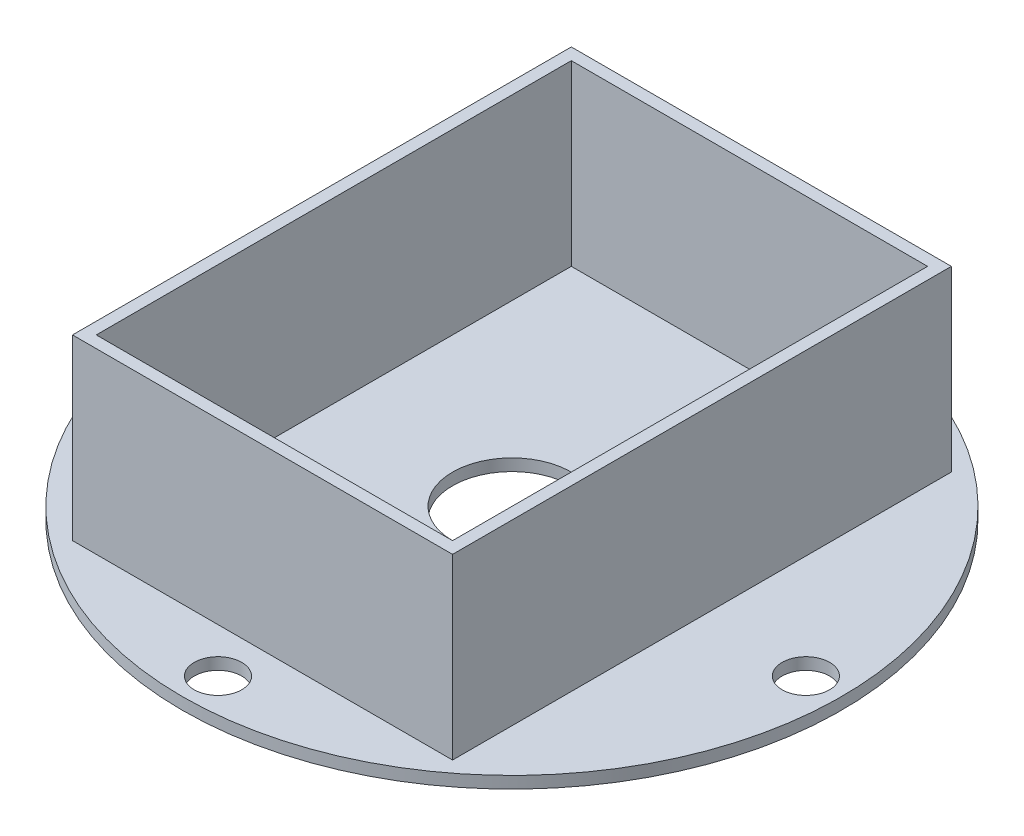
ISO-10303-21;
HEADER;
FILE_DESCRIPTION(('STEP AP214'),'2;1');
FILE_NAME('part.step','',(''),(''),'','','');
FILE_SCHEMA(('AUTOMOTIVE_DESIGN { 1 0 10303 214 1 1 1 1 }'));
ENDSEC;
DATA;
#1=APPLICATION_CONTEXT('core data for automotive mechanical design processes');
#2=APPLICATION_PROTOCOL_DEFINITION('international standard','automotive_design',2000,#1);
#3=PRODUCT_CONTEXT('',#1,'mechanical');
#4=PRODUCT('Part','Part','',(#3));
#5=PRODUCT_RELATED_PRODUCT_CATEGORY('part','',(#4));
#6=PRODUCT_DEFINITION_FORMATION('','',#4);
#7=PRODUCT_DEFINITION_CONTEXT('part definition',#1,'design');
#8=PRODUCT_DEFINITION('design','',#6,#7);
#9=PRODUCT_DEFINITION_SHAPE('','',#8);
#10=(LENGTH_UNIT() NAMED_UNIT(*) SI_UNIT(.MILLI.,.METRE.));
#11=(NAMED_UNIT(*) PLANE_ANGLE_UNIT() SI_UNIT($,.RADIAN.));
#12=(NAMED_UNIT(*) SI_UNIT($,.STERADIAN.) SOLID_ANGLE_UNIT());
#13=UNCERTAINTY_MEASURE_WITH_UNIT(LENGTH_MEASURE(1.E-05),#10,'distance_accuracy_value','');
#14=(GEOMETRIC_REPRESENTATION_CONTEXT(3) GLOBAL_UNCERTAINTY_ASSIGNED_CONTEXT((#13)) GLOBAL_UNIT_ASSIGNED_CONTEXT((#10,
#11,#12)) REPRESENTATION_CONTEXT('',''));
#15=CARTESIAN_POINT('',(0.,0.,0.));
#16=DIRECTION('',(0.,0.,1.));
#17=DIRECTION('',(1.,0.,0.));
#18=AXIS2_PLACEMENT_3D('',#15,#16,#17);
#19=CARTESIAN_POINT('',(0.,2.,0.));
#20=DIRECTION('',(0.,1.,0.));
#21=DIRECTION('',(0.,0.,1.));
#22=AXIS2_PLACEMENT_3D('',#19,#20,#21);
#23=PLANE('',#22);
#24=CARTESIAN_POINT('',(0.,2.,49.5));
#25=DIRECTION('',(0.,1.,0.));
#26=DIRECTION('',(0.,0.,1.));
#27=AXIS2_PLACEMENT_3D('',#24,#25,#26);
#28=CIRCLE('',#27,4.);
#29=CARTESIAN_POINT('',(0.,2.,53.5));
#30=VERTEX_POINT('',#29);
#31=EDGE_CURVE('E206',#30,#30,#28,.T.);
#32=ORIENTED_EDGE('',*,*,#31,.F.);
#33=EDGE_LOOP('',(#32));
#34=FACE_BOUND('',#33,.T.);
#35=CARTESIAN_POINT('',(49.5,2.,0.));
#36=DIRECTION('',(0.,1.,0.));
#37=DIRECTION('',(0.,0.,1.));
#38=AXIS2_PLACEMENT_3D('',#35,#36,#37);
#39=CIRCLE('',#38,4.);
#40=CARTESIAN_POINT('',(49.5,2.,4.));
#41=VERTEX_POINT('',#40);
#42=EDGE_CURVE('E222',#41,#41,#39,.T.);
#43=ORIENTED_EDGE('',*,*,#42,.F.);
#44=EDGE_LOOP('',(#43));
#45=FACE_BOUND('',#44,.T.);
#46=CARTESIAN_POINT('',(0.,2.,0.));
#47=DIRECTION('',(0.,1.,0.));
#48=DIRECTION('',(0.,0.,1.));
#49=AXIS2_PLACEMENT_3D('',#46,#47,#48);
#50=CIRCLE('',#49,55.5);
#51=CARTESIAN_POINT('',(0.,2.,55.5));
#52=VERTEX_POINT('',#51);
#53=EDGE_CURVE('E11',#52,#52,#50,.T.);
#54=ORIENTED_EDGE('',*,*,#53,.T.);
#55=EDGE_LOOP('',(#54));
#56=FACE_BOUND('',#55,.T.);
#57=CARTESIAN_POINT('',(0.,2.,-49.5));
#58=DIRECTION('',(0.,1.,0.));
#59=DIRECTION('',(0.,0.,1.));
#60=AXIS2_PLACEMENT_3D('',#57,#58,#59);
#61=CIRCLE('',#60,4.);
#62=CARTESIAN_POINT('',(0.,2.,-45.5));
#63=VERTEX_POINT('',#62);
#64=EDGE_CURVE('E230',#63,#63,#61,.T.);
#65=ORIENTED_EDGE('',*,*,#64,.F.);
#66=EDGE_LOOP('',(#65));
#67=FACE_BOUND('',#66,.T.);
#68=CARTESIAN_POINT('',(-49.5,2.,0.));
#69=DIRECTION('',(0.,1.,0.));
#70=DIRECTION('',(0.,0.,1.));
#71=AXIS2_PLACEMENT_3D('',#68,#69,#70);
#72=CIRCLE('',#71,4.);
#73=CARTESIAN_POINT('',(-49.5,2.,4.));
#74=VERTEX_POINT('',#73);
#75=EDGE_CURVE('E214',#74,#74,#72,.T.);
#76=ORIENTED_EDGE('',*,*,#75,.F.);
#77=EDGE_LOOP('',(#76));
#78=FACE_BOUND('',#77,.T.);
#79=DIRECTION('',(-1.,0.,0.));
#80=VECTOR('',#79,1.);
#81=CARTESIAN_POINT('',(-32.,2.,-42.));
#82=LINE('',#81,#80);
#83=CARTESIAN_POINT('',(32.,2.,-42.));
#84=VERTEX_POINT('',#83);
#85=CARTESIAN_POINT('',(-32.,2.,-42.));
#86=VERTEX_POINT('',#85);
#87=EDGE_CURVE('E185',#84,#86,#82,.T.);
#88=ORIENTED_EDGE('',*,*,#87,.F.);
#89=DIRECTION('',(0.,0.,-1.));
#90=VECTOR('',#89,1.);
#91=CARTESIAN_POINT('',(32.,2.,-42.));
#92=LINE('',#91,#90);
#93=CARTESIAN_POINT('',(32.,2.,42.));
#94=VERTEX_POINT('',#93);
#95=EDGE_CURVE('E134',#94,#84,#92,.T.);
#96=ORIENTED_EDGE('',*,*,#95,.F.);
#97=DIRECTION('',(1.,0.,0.));
#98=VECTOR('',#97,1.);
#99=CARTESIAN_POINT('',(-32.,2.,42.));
#100=LINE('',#99,#98);
#101=CARTESIAN_POINT('',(-32.,2.,42.));
#102=VERTEX_POINT('',#101);
#103=EDGE_CURVE('E172',#102,#94,#100,.T.);
#104=ORIENTED_EDGE('',*,*,#103,.F.);
#105=DIRECTION('',(0.,0.,1.));
#106=VECTOR('',#105,1.);
#107=CARTESIAN_POINT('',(-32.,2.,-42.));
#108=LINE('',#107,#106);
#109=EDGE_CURVE('E188',#86,#102,#108,.T.);
#110=ORIENTED_EDGE('',*,*,#109,.F.);
#111=EDGE_LOOP('',(#88,#96,#104,#110));
#112=FACE_BOUND('',#111,.T.);
#113=ADVANCED_FACE('F45',(#34,#45,#56,#67,#78,#112),#23,.T.);
#114=CARTESIAN_POINT('',(0.,0.,0.));
#115=DIRECTION('',(0.,1.,0.));
#116=DIRECTION('',(0.,0.,1.));
#117=AXIS2_PLACEMENT_3D('',#114,#115,#116);
#118=PLANE('',#117);
#119=CARTESIAN_POINT('',(0.,0.,0.));
#120=DIRECTION('',(0.,1.,0.));
#121=DIRECTION('',(0.,0.,1.));
#122=AXIS2_PLACEMENT_3D('',#119,#120,#121);
#123=CIRCLE('',#122,10.);
#124=CARTESIAN_POINT('',(0.,0.,10.));
#125=VERTEX_POINT('',#124);
#126=EDGE_CURVE('E49',#125,#125,#123,.T.);
#127=ORIENTED_EDGE('',*,*,#126,.T.);
#128=EDGE_LOOP('',(#127));
#129=FACE_BOUND('',#128,.T.);
#130=CARTESIAN_POINT('',(0.,0.,0.));
#131=DIRECTION('',(0.,1.,0.));
#132=DIRECTION('',(0.,0.,1.));
#133=AXIS2_PLACEMENT_3D('',#130,#131,#132);
#134=CIRCLE('',#133,55.5);
#135=CARTESIAN_POINT('',(0.,0.,55.5));
#136=VERTEX_POINT('',#135);
#137=EDGE_CURVE('E55',#136,#136,#134,.T.);
#138=ORIENTED_EDGE('',*,*,#137,.F.);
#139=EDGE_LOOP('',(#138));
#140=FACE_BOUND('',#139,.T.);
#141=CARTESIAN_POINT('',(0.,0.,-49.5));
#142=DIRECTION('',(0.,1.,0.));
#143=DIRECTION('',(0.,0.,1.));
#144=AXIS2_PLACEMENT_3D('',#141,#142,#143);
#145=CIRCLE('',#144,4.);
#146=CARTESIAN_POINT('',(0.,0.,-45.5));
#147=VERTEX_POINT('',#146);
#148=EDGE_CURVE('E226',#147,#147,#145,.T.);
#149=ORIENTED_EDGE('',*,*,#148,.T.);
#150=EDGE_LOOP('',(#149));
#151=FACE_BOUND('',#150,.T.);
#152=CARTESIAN_POINT('',(49.5,0.,0.));
#153=DIRECTION('',(0.,1.,0.));
#154=DIRECTION('',(0.,0.,1.));
#155=AXIS2_PLACEMENT_3D('',#152,#153,#154);
#156=CIRCLE('',#155,4.);
#157=CARTESIAN_POINT('',(49.5,0.,4.));
#158=VERTEX_POINT('',#157);
#159=EDGE_CURVE('E218',#158,#158,#156,.T.);
#160=ORIENTED_EDGE('',*,*,#159,.T.);
#161=EDGE_LOOP('',(#160));
#162=FACE_BOUND('',#161,.T.);
#163=CARTESIAN_POINT('',(-49.5,0.,0.));
#164=DIRECTION('',(0.,1.,0.));
#165=DIRECTION('',(0.,0.,1.));
#166=AXIS2_PLACEMENT_3D('',#163,#164,#165);
#167=CIRCLE('',#166,4.);
#168=CARTESIAN_POINT('',(-49.5,0.,4.));
#169=VERTEX_POINT('',#168);
#170=EDGE_CURVE('E210',#169,#169,#167,.T.);
#171=ORIENTED_EDGE('',*,*,#170,.T.);
#172=EDGE_LOOP('',(#171));
#173=FACE_BOUND('',#172,.T.);
#174=CARTESIAN_POINT('',(0.,0.,49.5));
#175=DIRECTION('',(0.,1.,0.));
#176=DIRECTION('',(0.,0.,1.));
#177=AXIS2_PLACEMENT_3D('',#174,#175,#176);
#178=CIRCLE('',#177,4.);
#179=CARTESIAN_POINT('',(0.,0.,53.5));
#180=VERTEX_POINT('',#179);
#181=EDGE_CURVE('E205',#180,#180,#178,.T.);
#182=ORIENTED_EDGE('',*,*,#181,.T.);
#183=EDGE_LOOP('',(#182));
#184=FACE_BOUND('',#183,.T.);
#185=ADVANCED_FACE('F241',(#129,#140,#151,#162,#173,#184),#118,.F.);
#186=CARTESIAN_POINT('',(0.,2.,0.));
#187=DIRECTION('',(0.,-1.,0.));
#188=DIRECTION('',(0.,0.,-1.));
#189=AXIS2_PLACEMENT_3D('',#186,#187,#188);
#190=CYLINDRICAL_SURFACE('',#189,55.5);
#191=ORIENTED_EDGE('',*,*,#53,.F.);
#192=EDGE_LOOP('',(#191));
#193=FACE_BOUND('',#192,.T.);
#194=ORIENTED_EDGE('',*,*,#137,.T.);
#195=EDGE_LOOP('',(#194));
#196=FACE_BOUND('',#195,.T.);
#197=ADVANCED_FACE('F47',(#193,#196),#190,.T.);
#198=CARTESIAN_POINT('',(0.,2.,-49.5));
#199=DIRECTION('',(0.,-1.,0.));
#200=DIRECTION('',(0.,0.,-1.));
#201=AXIS2_PLACEMENT_3D('',#198,#199,#200);
#202=CYLINDRICAL_SURFACE('',#201,4.);
#203=ORIENTED_EDGE('',*,*,#64,.T.);
#204=EDGE_LOOP('',(#203));
#205=FACE_BOUND('',#204,.T.);
#206=ORIENTED_EDGE('',*,*,#148,.F.);
#207=EDGE_LOOP('',(#206));
#208=FACE_BOUND('',#207,.T.);
#209=ADVANCED_FACE('F408',(#205,#208),#202,.F.);
#210=CARTESIAN_POINT('',(49.5,2.,0.));
#211=DIRECTION('',(0.,-1.,0.));
#212=DIRECTION('',(0.,0.,-1.));
#213=AXIS2_PLACEMENT_3D('',#210,#211,#212);
#214=CYLINDRICAL_SURFACE('',#213,4.);
#215=ORIENTED_EDGE('',*,*,#42,.T.);
#216=EDGE_LOOP('',(#215));
#217=FACE_BOUND('',#216,.T.);
#218=ORIENTED_EDGE('',*,*,#159,.F.);
#219=EDGE_LOOP('',(#218));
#220=FACE_BOUND('',#219,.T.);
#221=ADVANCED_FACE('F266',(#217,#220),#214,.F.);
#222=CARTESIAN_POINT('',(-49.5,2.,0.));
#223=DIRECTION('',(0.,-1.,0.));
#224=DIRECTION('',(0.,0.,-1.));
#225=AXIS2_PLACEMENT_3D('',#222,#223,#224);
#226=CYLINDRICAL_SURFACE('',#225,4.);
#227=ORIENTED_EDGE('',*,*,#75,.T.);
#228=EDGE_LOOP('',(#227));
#229=FACE_BOUND('',#228,.T.);
#230=ORIENTED_EDGE('',*,*,#170,.F.);
#231=EDGE_LOOP('',(#230));
#232=FACE_BOUND('',#231,.T.);
#233=ADVANCED_FACE('F255',(#229,#232),#226,.F.);
#234=CARTESIAN_POINT('',(0.,2.,49.5));
#235=DIRECTION('',(0.,-1.,0.));
#236=DIRECTION('',(0.,0.,-1.));
#237=AXIS2_PLACEMENT_3D('',#234,#235,#236);
#238=CYLINDRICAL_SURFACE('',#237,4.);
#239=ORIENTED_EDGE('',*,*,#31,.T.);
#240=EDGE_LOOP('',(#239));
#241=FACE_BOUND('',#240,.T.);
#242=ORIENTED_EDGE('',*,*,#181,.F.);
#243=EDGE_LOOP('',(#242));
#244=FACE_BOUND('',#243,.T.);
#245=ADVANCED_FACE('F253',(#241,#244),#238,.F.);
#246=CARTESIAN_POINT('',(0.,32.,0.));
#247=DIRECTION('',(0.,1.,0.));
#248=DIRECTION('',(0.,0.,1.));
#249=AXIS2_PLACEMENT_3D('',#246,#247,#248);
#250=PLANE('',#249);
#251=DIRECTION('',(0.,0.,-1.));
#252=VECTOR('',#251,1.);
#253=CARTESIAN_POINT('',(32.,32.,-42.));
#254=LINE('',#253,#252);
#255=CARTESIAN_POINT('',(32.,32.,42.));
#256=VERTEX_POINT('',#255);
#257=CARTESIAN_POINT('',(32.,32.,-42.));
#258=VERTEX_POINT('',#257);
#259=EDGE_CURVE('E167',#256,#258,#254,.T.);
#260=ORIENTED_EDGE('',*,*,#259,.T.);
#261=DIRECTION('',(-1.,0.,0.));
#262=VECTOR('',#261,1.);
#263=CARTESIAN_POINT('',(-32.,32.,-42.));
#264=LINE('',#263,#262);
#265=CARTESIAN_POINT('',(-32.,32.,-42.));
#266=VERTEX_POINT('',#265);
#267=EDGE_CURVE('E171',#258,#266,#264,.T.);
#268=ORIENTED_EDGE('',*,*,#267,.T.);
#269=DIRECTION('',(0.,0.,1.));
#270=VECTOR('',#269,1.);
#271=CARTESIAN_POINT('',(-32.,32.,-42.));
#272=LINE('',#271,#270);
#273=CARTESIAN_POINT('',(-32.,32.,42.));
#274=VERTEX_POINT('',#273);
#275=EDGE_CURVE('E175',#266,#274,#272,.T.);
#276=ORIENTED_EDGE('',*,*,#275,.T.);
#277=DIRECTION('',(1.,0.,0.));
#278=VECTOR('',#277,1.);
#279=CARTESIAN_POINT('',(-32.,32.,42.));
#280=LINE('',#279,#278);
#281=EDGE_CURVE('E178',#274,#256,#280,.T.);
#282=ORIENTED_EDGE('',*,*,#281,.T.);
#283=EDGE_LOOP('',(#260,#268,#276,#282));
#284=FACE_BOUND('',#283,.T.);
#285=DIRECTION('',(-1.,0.,0.));
#286=VECTOR('',#285,1.);
#287=CARTESIAN_POINT('',(-30.,32.,-40.));
#288=LINE('',#287,#286);
#289=CARTESIAN_POINT('',(30.,32.,-40.));
#290=VERTEX_POINT('',#289);
#291=CARTESIAN_POINT('',(-30.,32.,-40.));
#292=VERTEX_POINT('',#291);
#293=EDGE_CURVE('E125',#290,#292,#288,.T.);
#294=ORIENTED_EDGE('',*,*,#293,.F.);
#295=DIRECTION('',(0.,0.,-1.));
#296=VECTOR('',#295,1.);
#297=CARTESIAN_POINT('',(30.,32.,-40.));
#298=LINE('',#297,#296);
#299=CARTESIAN_POINT('',(30.,32.,40.));
#300=VERTEX_POINT('',#299);
#301=EDGE_CURVE('E115',#300,#290,#298,.T.);
#302=ORIENTED_EDGE('',*,*,#301,.F.);
#303=DIRECTION('',(1.,0.,0.));
#304=VECTOR('',#303,1.);
#305=CARTESIAN_POINT('',(-30.,32.,40.));
#306=LINE('',#305,#304);
#307=CARTESIAN_POINT('',(-30.,32.,40.));
#308=VERTEX_POINT('',#307);
#309=EDGE_CURVE('E144',#308,#300,#306,.T.);
#310=ORIENTED_EDGE('',*,*,#309,.F.);
#311=DIRECTION('',(0.,0.,1.));
#312=VECTOR('',#311,1.);
#313=CARTESIAN_POINT('',(-30.,32.,-40.));
#314=LINE('',#313,#312);
#315=EDGE_CURVE('E140',#292,#308,#314,.T.);
#316=ORIENTED_EDGE('',*,*,#315,.F.);
#317=EDGE_LOOP('',(#294,#302,#310,#316));
#318=FACE_BOUND('',#317,.T.);
#319=ADVANCED_FACE('F138',(#284,#318),#250,.T.);
#320=CARTESIAN_POINT('',(32.,32.,-42.));
#321=DIRECTION('',(-1.,0.,0.));
#322=DIRECTION('',(0.,0.,1.));
#323=AXIS2_PLACEMENT_3D('',#320,#321,#322);
#324=PLANE('',#323);
#325=ORIENTED_EDGE('',*,*,#95,.T.);
#326=DIRECTION('',(0.,-1.,0.));
#327=VECTOR('',#326,1.);
#328=CARTESIAN_POINT('',(32.,32.,-42.));
#329=LINE('',#328,#327);
#330=EDGE_CURVE('E202',#258,#84,#329,.T.);
#331=ORIENTED_EDGE('',*,*,#330,.F.);
#332=ORIENTED_EDGE('',*,*,#259,.F.);
#333=DIRECTION('',(0.,-1.,0.));
#334=VECTOR('',#333,1.);
#335=CARTESIAN_POINT('',(32.,32.,42.));
#336=LINE('',#335,#334);
#337=EDGE_CURVE('E181',#256,#94,#336,.T.);
#338=ORIENTED_EDGE('',*,*,#337,.T.);
#339=EDGE_LOOP('',(#325,#331,#332,#338));
#340=FACE_BOUND('',#339,.T.);
#341=ADVANCED_FACE('F263',(#340),#324,.F.);
#342=CARTESIAN_POINT('',(-32.,32.,-42.));
#343=DIRECTION('',(0.,0.,1.));
#344=DIRECTION('',(1.,0.,0.));
#345=AXIS2_PLACEMENT_3D('',#342,#343,#344);
#346=PLANE('',#345);
#347=ORIENTED_EDGE('',*,*,#87,.T.);
#348=DIRECTION('',(0.,-1.,0.));
#349=VECTOR('',#348,1.);
#350=CARTESIAN_POINT('',(-32.,32.,-42.));
#351=LINE('',#350,#349);
#352=EDGE_CURVE('E198',#266,#86,#351,.T.);
#353=ORIENTED_EDGE('',*,*,#352,.F.);
#354=ORIENTED_EDGE('',*,*,#267,.F.);
#355=ORIENTED_EDGE('',*,*,#330,.T.);
#356=EDGE_LOOP('',(#347,#353,#354,#355));
#357=FACE_BOUND('',#356,.T.);
#358=ADVANCED_FACE('F316',(#357),#346,.F.);
#359=CARTESIAN_POINT('',(-32.,32.,-42.));
#360=DIRECTION('',(1.,0.,0.));
#361=DIRECTION('',(0.,0.,-1.));
#362=AXIS2_PLACEMENT_3D('',#359,#360,#361);
#363=PLANE('',#362);
#364=ORIENTED_EDGE('',*,*,#109,.T.);
#365=DIRECTION('',(0.,-1.,0.));
#366=VECTOR('',#365,1.);
#367=CARTESIAN_POINT('',(-32.,32.,42.));
#368=LINE('',#367,#366);
#369=EDGE_CURVE('E63',#274,#102,#368,.T.);
#370=ORIENTED_EDGE('',*,*,#369,.F.);
#371=ORIENTED_EDGE('',*,*,#275,.F.);
#372=ORIENTED_EDGE('',*,*,#352,.T.);
#373=EDGE_LOOP('',(#364,#370,#371,#372));
#374=FACE_BOUND('',#373,.T.);
#375=ADVANCED_FACE('F313',(#374),#363,.F.);
#376=CARTESIAN_POINT('',(-32.,32.,42.));
#377=DIRECTION('',(0.,0.,-1.));
#378=DIRECTION('',(-1.,0.,0.));
#379=AXIS2_PLACEMENT_3D('',#376,#377,#378);
#380=PLANE('',#379);
#381=ORIENTED_EDGE('',*,*,#103,.T.);
#382=ORIENTED_EDGE('',*,*,#337,.F.);
#383=ORIENTED_EDGE('',*,*,#281,.F.);
#384=ORIENTED_EDGE('',*,*,#369,.T.);
#385=EDGE_LOOP('',(#381,#382,#383,#384));
#386=FACE_BOUND('',#385,.T.);
#387=ADVANCED_FACE('F309',(#386),#380,.F.);
#388=CARTESIAN_POINT('',(30.,32.,-40.));
#389=DIRECTION('',(-1.,0.,0.));
#390=DIRECTION('',(0.,0.,1.));
#391=AXIS2_PLACEMENT_3D('',#388,#389,#390);
#392=PLANE('',#391);
#393=DIRECTION('',(0.,0.,-1.));
#394=VECTOR('',#393,1.);
#395=CARTESIAN_POINT('',(30.,2.,-40.));
#396=LINE('',#395,#394);
#397=CARTESIAN_POINT('',(30.,2.,40.));
#398=VERTEX_POINT('',#397);
#399=CARTESIAN_POINT('',(30.,2.,-40.));
#400=VERTEX_POINT('',#399);
#401=EDGE_CURVE('E71',#398,#400,#396,.T.);
#402=ORIENTED_EDGE('',*,*,#401,.F.);
#403=DIRECTION('',(0.,-1.,0.));
#404=VECTOR('',#403,1.);
#405=CARTESIAN_POINT('',(30.,32.,40.));
#406=LINE('',#405,#404);
#407=EDGE_CURVE('E120',#300,#398,#406,.T.);
#408=ORIENTED_EDGE('',*,*,#407,.F.);
#409=ORIENTED_EDGE('',*,*,#301,.T.);
#410=DIRECTION('',(0.,-1.,0.));
#411=VECTOR('',#410,1.);
#412=CARTESIAN_POINT('',(30.,32.,-40.));
#413=LINE('',#412,#411);
#414=EDGE_CURVE('E118',#290,#400,#413,.T.);
#415=ORIENTED_EDGE('',*,*,#414,.T.);
#416=EDGE_LOOP('',(#402,#408,#409,#415));
#417=FACE_BOUND('',#416,.T.);
#418=ADVANCED_FACE('F117',(#417),#392,.T.);
#419=CARTESIAN_POINT('',(-30.,32.,-40.));
#420=DIRECTION('',(0.,0.,1.));
#421=DIRECTION('',(1.,0.,0.));
#422=AXIS2_PLACEMENT_3D('',#419,#420,#421);
#423=PLANE('',#422);
#424=DIRECTION('',(-1.,0.,0.));
#425=VECTOR('',#424,1.);
#426=CARTESIAN_POINT('',(-30.,2.,-40.));
#427=LINE('',#426,#425);
#428=CARTESIAN_POINT('',(-30.,2.,-40.));
#429=VERTEX_POINT('',#428);
#430=EDGE_CURVE('E132',#400,#429,#427,.T.);
#431=ORIENTED_EDGE('',*,*,#430,.F.);
#432=ORIENTED_EDGE('',*,*,#414,.F.);
#433=ORIENTED_EDGE('',*,*,#293,.T.);
#434=DIRECTION('',(0.,-1.,0.));
#435=VECTOR('',#434,1.);
#436=CARTESIAN_POINT('',(-30.,32.,-40.));
#437=LINE('',#436,#435);
#438=EDGE_CURVE('E135',#292,#429,#437,.T.);
#439=ORIENTED_EDGE('',*,*,#438,.T.);
#440=EDGE_LOOP('',(#431,#432,#433,#439));
#441=FACE_BOUND('',#440,.T.);
#442=ADVANCED_FACE('F129',(#441),#423,.T.);
#443=CARTESIAN_POINT('',(-30.,32.,-40.));
#444=DIRECTION('',(1.,0.,0.));
#445=DIRECTION('',(0.,0.,-1.));
#446=AXIS2_PLACEMENT_3D('',#443,#444,#445);
#447=PLANE('',#446);
#448=DIRECTION('',(0.,0.,1.));
#449=VECTOR('',#448,1.);
#450=CARTESIAN_POINT('',(-30.,2.,-40.));
#451=LINE('',#450,#449);
#452=CARTESIAN_POINT('',(-30.,2.,40.));
#453=VERTEX_POINT('',#452);
#454=EDGE_CURVE('E154',#429,#453,#451,.T.);
#455=ORIENTED_EDGE('',*,*,#454,.F.);
#456=ORIENTED_EDGE('',*,*,#438,.F.);
#457=ORIENTED_EDGE('',*,*,#315,.T.);
#458=DIRECTION('',(0.,-1.,0.));
#459=VECTOR('',#458,1.);
#460=CARTESIAN_POINT('',(-30.,32.,40.));
#461=LINE('',#460,#459);
#462=EDGE_CURVE('E161',#308,#453,#461,.T.);
#463=ORIENTED_EDGE('',*,*,#462,.T.);
#464=EDGE_LOOP('',(#455,#456,#457,#463));
#465=FACE_BOUND('',#464,.T.);
#466=ADVANCED_FACE('F288',(#465),#447,.T.);
#467=CARTESIAN_POINT('',(-30.,32.,40.));
#468=DIRECTION('',(0.,0.,-1.));
#469=DIRECTION('',(-1.,0.,0.));
#470=AXIS2_PLACEMENT_3D('',#467,#468,#469);
#471=PLANE('',#470);
#472=DIRECTION('',(1.,0.,0.));
#473=VECTOR('',#472,1.);
#474=CARTESIAN_POINT('',(-30.,2.,40.));
#475=LINE('',#474,#473);
#476=EDGE_CURVE('E126',#453,#398,#475,.T.);
#477=ORIENTED_EDGE('',*,*,#476,.F.);
#478=ORIENTED_EDGE('',*,*,#462,.F.);
#479=ORIENTED_EDGE('',*,*,#309,.T.);
#480=ORIENTED_EDGE('',*,*,#407,.T.);
#481=EDGE_LOOP('',(#477,#478,#479,#480));
#482=FACE_BOUND('',#481,.T.);
#483=ADVANCED_FACE('F280',(#482),#471,.T.);
#484=CARTESIAN_POINT('',(0.,2.,0.));
#485=DIRECTION('',(0.,1.,0.));
#486=DIRECTION('',(0.,0.,1.));
#487=AXIS2_PLACEMENT_3D('',#484,#485,#486);
#488=CIRCLE('',#487,10.);
#489=CARTESIAN_POINT('',(0.,2.,10.));
#490=VERTEX_POINT('',#489);
#491=EDGE_CURVE('E293',#490,#490,#488,.T.);
#492=ORIENTED_EDGE('',*,*,#491,.F.);
#493=EDGE_LOOP('',(#492));
#494=FACE_BOUND('',#493,.T.);
#495=ORIENTED_EDGE('',*,*,#401,.T.);
#496=ORIENTED_EDGE('',*,*,#430,.T.);
#497=ORIENTED_EDGE('',*,*,#454,.T.);
#498=ORIENTED_EDGE('',*,*,#476,.T.);
#499=EDGE_LOOP('',(#495,#496,#497,#498));
#500=FACE_BOUND('',#499,.T.);
#501=ADVANCED_FACE('F272',(#494,#500),#23,.T.);
#502=CARTESIAN_POINT('',(0.,-28.,0.));
#503=DIRECTION('',(0.,1.,0.));
#504=DIRECTION('',(0.,0.,1.));
#505=AXIS2_PLACEMENT_3D('',#502,#503,#504);
#506=CYLINDRICAL_SURFACE('',#505,10.);
#507=ORIENTED_EDGE('',*,*,#491,.T.);
#508=EDGE_LOOP('',(#507));
#509=FACE_BOUND('',#508,.T.);
#510=ORIENTED_EDGE('',*,*,#126,.F.);
#511=EDGE_LOOP('',(#510));
#512=FACE_BOUND('',#511,.T.);
#513=ADVANCED_FACE('F279',(#509,#512),#506,.F.);
#514=CLOSED_SHELL('',(#113,#185,#197,#209,#221,#233,#245,#319,#341,#358,#375,#387,#418,#442,
#466,#483,#501,#513));
#515=MANIFOLD_SOLID_BREP('B2',#514);
#516=ADVANCED_BREP_SHAPE_REPRESENTATION('',(#18,#515),#14);
#517=SHAPE_DEFINITION_REPRESENTATION(#9,#516);
ENDSEC;
END-ISO-10303-21;
